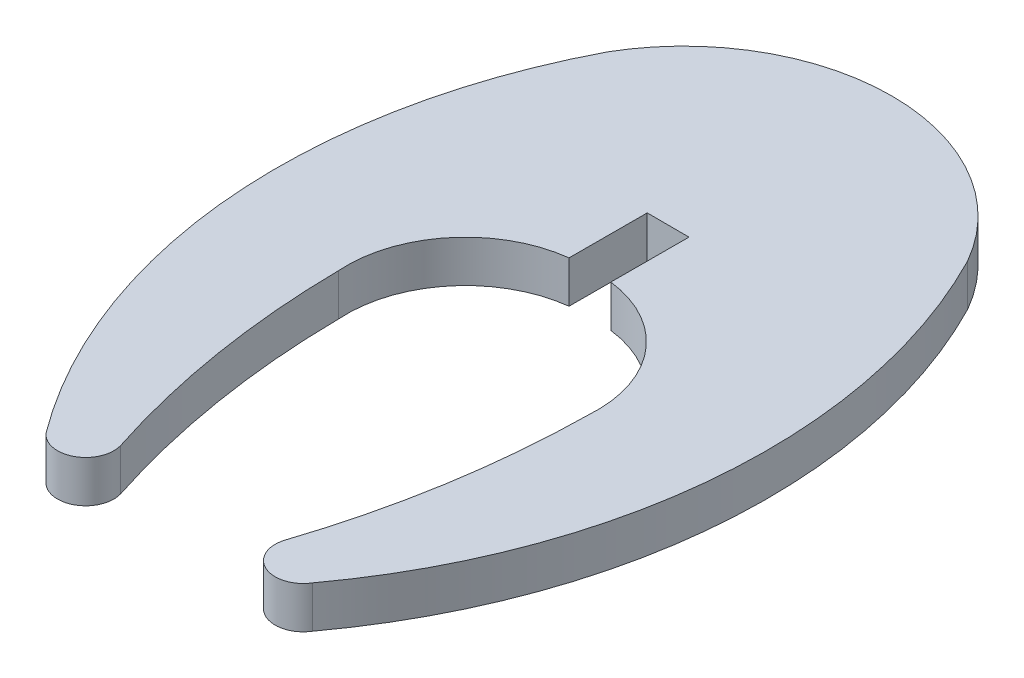
ISO-10303-21;
HEADER;
FILE_DESCRIPTION(('STEP AP214'),'2;1');
FILE_NAME('part.step','',(''),(''),'','','');
FILE_SCHEMA(('AUTOMOTIVE_DESIGN { 1 0 10303 214 1 1 1 1 }'));
ENDSEC;
DATA;
#1=APPLICATION_CONTEXT('core data for automotive mechanical design processes');
#2=APPLICATION_PROTOCOL_DEFINITION('international standard','automotive_design',2000,#1);
#3=PRODUCT_CONTEXT('',#1,'mechanical');
#4=PRODUCT('Part','Part','',(#3));
#5=PRODUCT_RELATED_PRODUCT_CATEGORY('part','',(#4));
#6=PRODUCT_DEFINITION_FORMATION('','',#4);
#7=PRODUCT_DEFINITION_CONTEXT('part definition',#1,'design');
#8=PRODUCT_DEFINITION('design','',#6,#7);
#9=PRODUCT_DEFINITION_SHAPE('','',#8);
#10=(LENGTH_UNIT() NAMED_UNIT(*) SI_UNIT(.MILLI.,.METRE.));
#11=(NAMED_UNIT(*) PLANE_ANGLE_UNIT() SI_UNIT($,.RADIAN.));
#12=(NAMED_UNIT(*) SI_UNIT($,.STERADIAN.) SOLID_ANGLE_UNIT());
#13=UNCERTAINTY_MEASURE_WITH_UNIT(LENGTH_MEASURE(1.E-05),#10,'distance_accuracy_value','');
#14=(GEOMETRIC_REPRESENTATION_CONTEXT(3) GLOBAL_UNCERTAINTY_ASSIGNED_CONTEXT((#13)) GLOBAL_UNIT_ASSIGNED_CONTEXT((#10,
#11,#12)) REPRESENTATION_CONTEXT('',''));
#15=CARTESIAN_POINT('',(0.,0.,0.));
#16=DIRECTION('',(0.,0.,1.));
#17=DIRECTION('',(1.,0.,0.));
#18=AXIS2_PLACEMENT_3D('',#15,#16,#17);
#19=CARTESIAN_POINT('',(-41978.014555,3.,-18278.107615));
#20=DIRECTION('',(0.99999818270925,0.,0.00190645697487852));
#21=DIRECTION('',(0.00190645697487852,0.,-0.99999818270925));
#22=AXIS2_PLACEMENT_3D('',#19,#20,#21);
#23=PLANE('',#22);
#24=DIRECTION('',(-0.00190645697487852,0.,0.99999818270925));
#25=VECTOR('',#24,1.);
#26=CARTESIAN_POINT('',(-41978.014555,0.,-18278.107615));
#27=LINE('',#26,#25);
#28=CARTESIAN_POINT('',(-41978.003906,0.,-18283.693359));
#29=VERTEX_POINT('',#28);
#30=CARTESIAN_POINT('',(-41978.014555,0.,-18278.107615));
#31=VERTEX_POINT('',#30);
#32=EDGE_CURVE('E155',#29,#31,#27,.T.);
#33=ORIENTED_EDGE('',*,*,#32,.T.);
#34=DIRECTION('',(0.,-1.,0.));
#35=VECTOR('',#34,1.);
#36=CARTESIAN_POINT('',(-41978.014555,3.,-18278.107615));
#37=LINE('',#36,#35);
#38=CARTESIAN_POINT('',(-41978.014555,3.,-18278.107615));
#39=VERTEX_POINT('',#38);
#40=EDGE_CURVE('E11',#39,#31,#37,.T.);
#41=ORIENTED_EDGE('',*,*,#40,.F.);
#42=DIRECTION('',(-0.00190645697487852,0.,0.99999818270925));
#43=VECTOR('',#42,1.);
#44=CARTESIAN_POINT('',(-41978.014555,3.,-18278.107615));
#45=LINE('',#44,#43);
#46=CARTESIAN_POINT('',(-41978.003906,3.,-18283.693359));
#47=VERTEX_POINT('',#46);
#48=EDGE_CURVE('E177',#47,#39,#45,.T.);
#49=ORIENTED_EDGE('',*,*,#48,.F.);
#50=DIRECTION('',(0.,-1.,0.));
#51=VECTOR('',#50,1.);
#52=CARTESIAN_POINT('',(-41978.003906,3.,-18283.693359));
#53=LINE('',#52,#51);
#54=EDGE_CURVE('E151',#47,#29,#53,.T.);
#55=ORIENTED_EDGE('',*,*,#54,.T.);
#56=EDGE_LOOP('',(#33,#41,#49,#55));
#57=FACE_BOUND('',#56,.T.);
#58=ADVANCED_FACE('F35',(#57),#23,.F.);
#59=CARTESIAN_POINT('',(-41979.0463736365,3.,-18269.6810291466));
#60=DIRECTION('',(0.,-1.,0.));
#61=DIRECTION('',(0.,0.,-1.));
#62=AXIS2_PLACEMENT_3D('',#59,#60,#61);
#63=CYLINDRICAL_SURFACE('',#62,8.48952288670097);
#64=CARTESIAN_POINT('',(-41979.0463736365,0.,-18269.6810291466));
#65=DIRECTION('',(0.,-1.,0.));
#66=DIRECTION('',(0.,0.,1.));
#67=AXIS2_PLACEMENT_3D('',#64,#65,#66);
#68=CIRCLE('',#67,8.48952288670097);
#69=CARTESIAN_POINT('',(-41970.581367,0.,-18269.036311));
#70=VERTEX_POINT('',#69);
#71=EDGE_CURVE('E158',#31,#70,#68,.T.);
#72=ORIENTED_EDGE('',*,*,#71,.T.);
#73=DIRECTION('',(0.,-1.,0.));
#74=VECTOR('',#73,1.);
#75=CARTESIAN_POINT('',(-41970.581367,3.,-18269.036311));
#76=LINE('',#75,#74);
#77=CARTESIAN_POINT('',(-41970.581367,3.,-18269.036311));
#78=VERTEX_POINT('',#77);
#79=EDGE_CURVE('E43',#78,#70,#76,.T.);
#80=ORIENTED_EDGE('',*,*,#79,.F.);
#81=CARTESIAN_POINT('',(-41979.0463736365,3.,-18269.6810291466));
#82=DIRECTION('',(0.,-1.,0.));
#83=DIRECTION('',(0.,0.,1.));
#84=AXIS2_PLACEMENT_3D('',#81,#82,#83);
#85=CIRCLE('',#84,8.48952288670097);
#86=EDGE_CURVE('E106',#39,#78,#85,.T.);
#87=ORIENTED_EDGE('',*,*,#86,.F.);
#88=ORIENTED_EDGE('',*,*,#40,.T.);
#89=EDGE_LOOP('',(#72,#80,#87,#88));
#90=FACE_BOUND('',#89,.T.);
#91=ADVANCED_FACE('F255',(#90),#63,.F.);
#92=CARTESIAN_POINT('',(-42032.8945841506,3.,-18269.8590562763));
#93=DIRECTION('',(0.,-1.,0.));
#94=DIRECTION('',(0.,0.,-1.));
#95=AXIS2_PLACEMENT_3D('',#92,#93,#94);
#96=CYLINDRICAL_SURFACE('',#95,62.3186484243966);
#97=CARTESIAN_POINT('',(-42032.8945841506,0.,-18269.8590562763));
#98=DIRECTION('',(0.,-1.,0.));
#99=DIRECTION('',(0.,0.,1.));
#100=AXIS2_PLACEMENT_3D('',#97,#98,#99);
#101=CIRCLE('',#100,62.3186484243966);
#102=CARTESIAN_POINT('',(-41973.686376,0.,-18250.416782));
#103=VERTEX_POINT('',#102);
#104=EDGE_CURVE('E160',#70,#103,#101,.T.);
#105=ORIENTED_EDGE('',*,*,#104,.T.);
#106=DIRECTION('',(0.,-1.,0.));
#107=VECTOR('',#106,1.);
#108=CARTESIAN_POINT('',(-41973.686376,3.,-18250.416782));
#109=LINE('',#108,#107);
#110=CARTESIAN_POINT('',(-41973.686376,3.,-18250.416782));
#111=VERTEX_POINT('',#110);
#112=EDGE_CURVE('E196',#111,#103,#109,.T.);
#113=ORIENTED_EDGE('',*,*,#112,.F.);
#114=CARTESIAN_POINT('',(-42032.8945841506,3.,-18269.8590562763));
#115=DIRECTION('',(0.,-1.,0.));
#116=DIRECTION('',(0.,0.,1.));
#117=AXIS2_PLACEMENT_3D('',#114,#115,#116);
#118=CIRCLE('',#117,62.3186484243966);
#119=EDGE_CURVE('E204',#78,#111,#118,.T.);
#120=ORIENTED_EDGE('',*,*,#119,.F.);
#121=ORIENTED_EDGE('',*,*,#79,.T.);
#122=EDGE_LOOP('',(#105,#113,#120,#121));
#123=FACE_BOUND('',#122,.T.);
#124=ADVANCED_FACE('F202',(#123),#96,.F.);
#125=CARTESIAN_POINT('',(-41971.7584335091,3.,-18249.832309272));
#126=DIRECTION('',(0.,-1.,0.));
#127=DIRECTION('',(0.,0.,-1.));
#128=AXIS2_PLACEMENT_3D('',#125,#126,#127);
#129=CYLINDRICAL_SURFACE('',#128,2.01458944149974);
#130=CARTESIAN_POINT('',(-41971.7584335091,0.,-18249.832309272));
#131=DIRECTION('',(0.,1.,0.));
#132=DIRECTION('',(0.,0.,1.));
#133=AXIS2_PLACEMENT_3D('',#130,#131,#132);
#134=CIRCLE('',#133,2.01458944149974);
#135=CARTESIAN_POINT('',(-41970.038411,0.,-18248.783456));
#136=VERTEX_POINT('',#135);
#137=EDGE_CURVE('E162',#103,#136,#134,.T.);
#138=ORIENTED_EDGE('',*,*,#137,.T.);
#139=DIRECTION('',(0.,-1.,0.));
#140=VECTOR('',#139,1.);
#141=CARTESIAN_POINT('',(-41970.038411,3.,-18248.783456));
#142=LINE('',#141,#140);
#143=CARTESIAN_POINT('',(-41970.038411,3.,-18248.783456));
#144=VERTEX_POINT('',#143);
#145=EDGE_CURVE('E193',#144,#136,#142,.T.);
#146=ORIENTED_EDGE('',*,*,#145,.F.);
#147=CARTESIAN_POINT('',(-41971.7584335091,3.,-18249.832309272));
#148=DIRECTION('',(0.,1.,0.));
#149=DIRECTION('',(0.,0.,1.));
#150=AXIS2_PLACEMENT_3D('',#147,#148,#149);
#151=CIRCLE('',#150,2.01458944149974);
#152=EDGE_CURVE('E222',#111,#144,#151,.T.);
#153=ORIENTED_EDGE('',*,*,#152,.F.);
#154=ORIENTED_EDGE('',*,*,#112,.T.);
#155=EDGE_LOOP('',(#138,#146,#153,#154));
#156=FACE_BOUND('',#155,.T.);
#157=ADVANCED_FACE('F213',(#156),#129,.T.);
#158=CARTESIAN_POINT('',(-42003.3360082486,3.,-18273.3038001917));
#159=DIRECTION('',(0.,-1.,0.));
#160=DIRECTION('',(0.,0.,-1.));
#161=AXIS2_PLACEMENT_3D('',#158,#159,#160);
#162=CYLINDRICAL_SURFACE('',#161,41.3518713216953);
#163=CARTESIAN_POINT('',(-42003.3360082486,0.,-18273.3038001917));
#164=DIRECTION('',(0.,1.,0.));
#165=DIRECTION('',(0.,0.,1.));
#166=AXIS2_PLACEMENT_3D('',#163,#164,#165);
#167=CIRCLE('',#166,41.3518713216953);
#168=CARTESIAN_POINT('',(-41966.550728,0.,-18292.193491));
#169=VERTEX_POINT('',#168);
#170=EDGE_CURVE('E164',#136,#169,#167,.T.);
#171=ORIENTED_EDGE('',*,*,#170,.T.);
#172=DIRECTION('',(0.,-1.,0.));
#173=VECTOR('',#172,1.);
#174=CARTESIAN_POINT('',(-41966.550728,3.,-18292.193491));
#175=LINE('',#174,#173);
#176=CARTESIAN_POINT('',(-41966.550728,3.,-18292.193491));
#177=VERTEX_POINT('',#176);
#178=EDGE_CURVE('E190',#177,#169,#175,.T.);
#179=ORIENTED_EDGE('',*,*,#178,.F.);
#180=CARTESIAN_POINT('',(-42003.3360082486,3.,-18273.3038001917));
#181=DIRECTION('',(0.,1.,0.));
#182=DIRECTION('',(0.,0.,1.));
#183=AXIS2_PLACEMENT_3D('',#180,#181,#182);
#184=CIRCLE('',#183,41.3518713216953);
#185=EDGE_CURVE('E219',#144,#177,#184,.T.);
#186=ORIENTED_EDGE('',*,*,#185,.F.);
#187=ORIENTED_EDGE('',*,*,#145,.T.);
#188=EDGE_LOOP('',(#171,#179,#186,#187));
#189=FACE_BOUND('',#188,.T.);
#190=ADVANCED_FACE('F217',(#189),#162,.T.);
#191=CARTESIAN_POINT('',(-41979.499189316,3.,-18284.8027257882));
#192=DIRECTION('',(0.,-1.,0.));
#193=DIRECTION('',(0.,0.,-1.));
#194=AXIS2_PLACEMENT_3D('',#191,#192,#193);
#195=CYLINDRICAL_SURFACE('',#194,14.9092609095013);
#196=CARTESIAN_POINT('',(-41979.499189316,0.,-18284.8027257882));
#197=DIRECTION('',(0.,1.,0.));
#198=DIRECTION('',(0.,0.,1.));
#199=AXIS2_PLACEMENT_3D('',#196,#197,#198);
#200=CIRCLE('',#199,14.9092609095013);
#201=CARTESIAN_POINT('',(-41992.4218499999,0.,-18292.238511));
#202=VERTEX_POINT('',#201);
#203=EDGE_CURVE('E166',#169,#202,#200,.T.);
#204=ORIENTED_EDGE('',*,*,#203,.T.);
#205=DIRECTION('',(0.,-1.,0.));
#206=VECTOR('',#205,1.);
#207=CARTESIAN_POINT('',(-41992.4218499999,3.,-18292.238511));
#208=LINE('',#207,#206);
#209=CARTESIAN_POINT('',(-41992.4218499999,3.,-18292.238511));
#210=VERTEX_POINT('',#209);
#211=EDGE_CURVE('E187',#210,#202,#208,.T.);
#212=ORIENTED_EDGE('',*,*,#211,.F.);
#213=CARTESIAN_POINT('',(-41979.499189316,3.,-18284.8027257882));
#214=DIRECTION('',(0.,1.,0.));
#215=DIRECTION('',(0.,0.,1.));
#216=AXIS2_PLACEMENT_3D('',#213,#214,#215);
#217=CIRCLE('',#216,14.9092609095013);
#218=EDGE_CURVE('E221',#177,#210,#217,.T.);
#219=ORIENTED_EDGE('',*,*,#218,.F.);
#220=ORIENTED_EDGE('',*,*,#178,.T.);
#221=EDGE_LOOP('',(#204,#212,#219,#220));
#222=FACE_BOUND('',#221,.T.);
#223=ADVANCED_FACE('F268',(#222),#195,.T.);
#224=CARTESIAN_POINT('',(-41955.703242732,3.,-18273.2201987383));
#225=DIRECTION('',(0.,-1.,0.));
#226=DIRECTION('',(0.,0.,-1.));
#227=AXIS2_PLACEMENT_3D('',#224,#225,#226);
#228=CYLINDRICAL_SURFACE('',#227,41.3515697523059);
#229=CARTESIAN_POINT('',(-41955.703242732,0.,-18273.2201987383));
#230=DIRECTION('',(0.,1.,0.));
#231=DIRECTION('',(0.,0.,1.));
#232=AXIS2_PLACEMENT_3D('',#229,#230,#231);
#233=CIRCLE('',#232,41.3515697523059);
#234=CARTESIAN_POINT('',(-41988.869274,0.,-18248.5226949999));
#235=VERTEX_POINT('',#234);
#236=EDGE_CURVE('E168',#202,#235,#233,.T.);
#237=ORIENTED_EDGE('',*,*,#236,.T.);
#238=DIRECTION('',(0.,-1.,0.));
#239=VECTOR('',#238,1.);
#240=CARTESIAN_POINT('',(-41988.869274,3.,-18248.5226949999));
#241=LINE('',#240,#239);
#242=CARTESIAN_POINT('',(-41988.869274,3.,-18248.5226949999));
#243=VERTEX_POINT('',#242);
#244=EDGE_CURVE('E184',#243,#235,#241,.T.);
#245=ORIENTED_EDGE('',*,*,#244,.F.);
#246=CARTESIAN_POINT('',(-41955.703242732,3.,-18273.2201987383));
#247=DIRECTION('',(0.,1.,0.));
#248=DIRECTION('',(0.,0.,1.));
#249=AXIS2_PLACEMENT_3D('',#246,#247,#248);
#250=CIRCLE('',#249,41.3515697523059);
#251=EDGE_CURVE('E224',#210,#243,#250,.T.);
#252=ORIENTED_EDGE('',*,*,#251,.F.);
#253=ORIENTED_EDGE('',*,*,#211,.T.);
#254=EDGE_LOOP('',(#237,#245,#252,#253));
#255=FACE_BOUND('',#254,.T.);
#256=ADVANCED_FACE('F271',(#255),#228,.T.);
#257=CARTESIAN_POINT('',(-41987.3605882213,3.,-18249.8567467603));
#258=DIRECTION('',(0.,-1.,0.));
#259=DIRECTION('',(0.,0.,-1.));
#260=AXIS2_PLACEMENT_3D('',#257,#258,#259);
#261=CYLINDRICAL_SURFACE('',#260,2.01390835897314);
#262=CARTESIAN_POINT('',(-41987.3605882213,0.,-18249.8567467603));
#263=DIRECTION('',(0.,1.,0.));
#264=DIRECTION('',(0.,0.,1.));
#265=AXIS2_PLACEMENT_3D('',#262,#263,#264);
#266=CIRCLE('',#265,2.01390835897314);
#267=CARTESIAN_POINT('',(-41985.431754,0.,-18250.435906));
#268=VERTEX_POINT('',#267);
#269=EDGE_CURVE('E170',#235,#268,#266,.T.);
#270=ORIENTED_EDGE('',*,*,#269,.T.);
#271=DIRECTION('',(0.,-1.,0.));
#272=VECTOR('',#271,1.);
#273=CARTESIAN_POINT('',(-41985.431754,3.,-18250.435906));
#274=LINE('',#273,#272);
#275=CARTESIAN_POINT('',(-41985.431754,3.,-18250.435906));
#276=VERTEX_POINT('',#275);
#277=EDGE_CURVE('E181',#276,#268,#274,.T.);
#278=ORIENTED_EDGE('',*,*,#277,.F.);
#279=CARTESIAN_POINT('',(-41987.3605882213,3.,-18249.8567467603));
#280=DIRECTION('',(0.,1.,0.));
#281=DIRECTION('',(0.,0.,1.));
#282=AXIS2_PLACEMENT_3D('',#279,#280,#281);
#283=CIRCLE('',#282,2.01390835897314);
#284=EDGE_CURVE('E230',#243,#276,#283,.T.);
#285=ORIENTED_EDGE('',*,*,#284,.F.);
#286=ORIENTED_EDGE('',*,*,#244,.T.);
#287=EDGE_LOOP('',(#270,#278,#285,#286));
#288=FACE_BOUND('',#287,.T.);
#289=ADVANCED_FACE('F236',(#288),#261,.T.);
#290=CARTESIAN_POINT('',(-41926.1555870674,3.,-18269.6678099927));
#291=DIRECTION('',(0.,-1.,0.));
#292=DIRECTION('',(0.,0.,-1.));
#293=AXIS2_PLACEMENT_3D('',#290,#291,#292);
#294=CYLINDRICAL_SURFACE('',#293,62.3179757164994);
#295=CARTESIAN_POINT('',(-41926.1555870674,0.,-18269.6678099927));
#296=DIRECTION('',(0.,-1.,0.));
#297=DIRECTION('',(0.,0.,1.));
#298=AXIS2_PLACEMENT_3D('',#295,#296,#297);
#299=CIRCLE('',#298,62.3179757164994);
#300=CARTESIAN_POINT('',(-41988.470698,0.,-18269.070276));
#301=VERTEX_POINT('',#300);
#302=EDGE_CURVE('E172',#268,#301,#299,.T.);
#303=ORIENTED_EDGE('',*,*,#302,.T.);
#304=DIRECTION('',(0.,-1.,0.));
#305=VECTOR('',#304,1.);
#306=CARTESIAN_POINT('',(-41988.470698,3.,-18269.070276));
#307=LINE('',#306,#305);
#308=CARTESIAN_POINT('',(-41988.470698,3.,-18269.070276));
#309=VERTEX_POINT('',#308);
#310=EDGE_CURVE('E146',#309,#301,#307,.T.);
#311=ORIENTED_EDGE('',*,*,#310,.F.);
#312=CARTESIAN_POINT('',(-41926.1555870674,3.,-18269.6678099927));
#313=DIRECTION('',(0.,-1.,0.));
#314=DIRECTION('',(0.,0.,1.));
#315=AXIS2_PLACEMENT_3D('',#312,#313,#314);
#316=CIRCLE('',#315,62.3179757164994);
#317=EDGE_CURVE('E137',#276,#309,#316,.T.);
#318=ORIENTED_EDGE('',*,*,#317,.F.);
#319=ORIENTED_EDGE('',*,*,#277,.T.);
#320=EDGE_LOOP('',(#303,#311,#318,#319));
#321=FACE_BOUND('',#320,.T.);
#322=ADVANCED_FACE('F240',(#321),#294,.F.);
#323=CARTESIAN_POINT('',(-41980.0044581417,3.,-18269.6829247474));
#324=DIRECTION('',(0.,-1.,0.));
#325=DIRECTION('',(0.,0.,-1.));
#326=AXIS2_PLACEMENT_3D('',#323,#324,#325);
#327=CYLINDRICAL_SURFACE('',#326,8.4883776909998);
#328=CARTESIAN_POINT('',(-41980.0044581417,0.,-18269.6829247474));
#329=DIRECTION('',(0.,-1.,0.));
#330=DIRECTION('',(0.,0.,1.));
#331=AXIS2_PLACEMENT_3D('',#328,#329,#330);
#332=CIRCLE('',#331,8.4883776909998);
#333=CARTESIAN_POINT('',(-41981.011719,0.,-18278.111328));
#334=VERTEX_POINT('',#333);
#335=EDGE_CURVE('E145',#301,#334,#332,.T.);
#336=ORIENTED_EDGE('',*,*,#335,.T.);
#337=DIRECTION('',(0.,-1.,0.));
#338=VECTOR('',#337,1.);
#339=CARTESIAN_POINT('',(-41981.011719,3.,-18278.111328));
#340=LINE('',#339,#338);
#341=CARTESIAN_POINT('',(-41981.011719,3.,-18278.111328));
#342=VERTEX_POINT('',#341);
#343=EDGE_CURVE('E142',#342,#334,#340,.T.);
#344=ORIENTED_EDGE('',*,*,#343,.F.);
#345=CARTESIAN_POINT('',(-41980.0044581417,3.,-18269.6829247474));
#346=DIRECTION('',(0.,-1.,0.));
#347=DIRECTION('',(0.,0.,1.));
#348=AXIS2_PLACEMENT_3D('',#345,#346,#347);
#349=CIRCLE('',#348,8.4883776909998);
#350=EDGE_CURVE('E131',#309,#342,#349,.T.);
#351=ORIENTED_EDGE('',*,*,#350,.F.);
#352=ORIENTED_EDGE('',*,*,#310,.T.);
#353=EDGE_LOOP('',(#336,#344,#351,#352));
#354=FACE_BOUND('',#353,.T.);
#355=ADVANCED_FACE('F143',(#354),#327,.F.);
#356=CARTESIAN_POINT('',(-41981.,3.,-18283.701172));
#357=DIRECTION('',(-0.999997802391605,0.,-0.00209647608161602));
#358=DIRECTION('',(-0.00209647608161602,0.,0.999997802391605));
#359=AXIS2_PLACEMENT_3D('',#356,#357,#358);
#360=PLANE('',#359);
#361=DIRECTION('',(0.00209647608161602,0.,-0.999997802391605));
#362=VECTOR('',#361,1.);
#363=CARTESIAN_POINT('',(-41981.,0.,-18283.701172));
#364=LINE('',#363,#362);
#365=CARTESIAN_POINT('',(-41981.,0.,-18283.701172));
#366=VERTEX_POINT('',#365);
#367=EDGE_CURVE('E92',#334,#366,#364,.T.);
#368=ORIENTED_EDGE('',*,*,#367,.T.);
#369=DIRECTION('',(0.,-1.,0.));
#370=VECTOR('',#369,1.);
#371=CARTESIAN_POINT('',(-41981.,3.,-18283.701172));
#372=LINE('',#371,#370);
#373=CARTESIAN_POINT('',(-41981.,3.,-18283.701172));
#374=VERTEX_POINT('',#373);
#375=EDGE_CURVE('E147',#374,#366,#372,.T.);
#376=ORIENTED_EDGE('',*,*,#375,.F.);
#377=DIRECTION('',(0.00209647608161602,0.,-0.999997802391605));
#378=VECTOR('',#377,1.);
#379=CARTESIAN_POINT('',(-41981.,3.,-18283.701172));
#380=LINE('',#379,#378);
#381=EDGE_CURVE('E135',#342,#374,#380,.T.);
#382=ORIENTED_EDGE('',*,*,#381,.F.);
#383=ORIENTED_EDGE('',*,*,#343,.T.);
#384=EDGE_LOOP('',(#368,#376,#382,#383));
#385=FACE_BOUND('',#384,.T.);
#386=ADVANCED_FACE('F149',(#385),#360,.F.);
#387=CARTESIAN_POINT('',(-41978.003906,3.,-18283.693359));
#388=DIRECTION('',(0.00260771972935821,0.,-0.999996599893126));
#389=DIRECTION('',(-0.999996599893126,0.,-0.00260771972935821));
#390=AXIS2_PLACEMENT_3D('',#387,#388,#389);
#391=PLANE('',#390);
#392=DIRECTION('',(0.999996599893126,0.,0.00260771972935821));
#393=VECTOR('',#392,1.);
#394=CARTESIAN_POINT('',(-41978.003906,0.,-18283.693359));
#395=LINE('',#394,#393);
#396=EDGE_CURVE('E98',#366,#29,#395,.T.);
#397=ORIENTED_EDGE('',*,*,#396,.T.);
#398=ORIENTED_EDGE('',*,*,#54,.F.);
#399=DIRECTION('',(0.999996599893126,0.,0.00260771972935821));
#400=VECTOR('',#399,1.);
#401=CARTESIAN_POINT('',(-41978.003906,3.,-18283.693359));
#402=LINE('',#401,#400);
#403=EDGE_CURVE('E51',#374,#47,#402,.T.);
#404=ORIENTED_EDGE('',*,*,#403,.F.);
#405=ORIENTED_EDGE('',*,*,#375,.T.);
#406=EDGE_LOOP('',(#397,#398,#404,#405));
#407=FACE_BOUND('',#406,.T.);
#408=ADVANCED_FACE('F244',(#407),#391,.F.);
#409=CARTESIAN_POINT('',(-41980.0044581417,3.,-18269.6829247474));
#410=DIRECTION('',(0.,1.,0.));
#411=DIRECTION('',(0.,0.,1.));
#412=AXIS2_PLACEMENT_3D('',#409,#410,#411);
#413=PLANE('',#412);
#414=ORIENTED_EDGE('',*,*,#48,.T.);
#415=ORIENTED_EDGE('',*,*,#86,.T.);
#416=ORIENTED_EDGE('',*,*,#119,.T.);
#417=ORIENTED_EDGE('',*,*,#152,.T.);
#418=ORIENTED_EDGE('',*,*,#185,.T.);
#419=ORIENTED_EDGE('',*,*,#218,.T.);
#420=ORIENTED_EDGE('',*,*,#251,.T.);
#421=ORIENTED_EDGE('',*,*,#284,.T.);
#422=ORIENTED_EDGE('',*,*,#317,.T.);
#423=ORIENTED_EDGE('',*,*,#350,.T.);
#424=ORIENTED_EDGE('',*,*,#381,.T.);
#425=ORIENTED_EDGE('',*,*,#403,.T.);
#426=EDGE_LOOP('',(#414,#415,#416,#417,#418,#419,#420,#421,#422,#423,#424,#425));
#427=FACE_BOUND('',#426,.T.);
#428=ADVANCED_FACE('F133',(#427),#413,.T.);
#429=CARTESIAN_POINT('',(-41980.0044581417,0.,-18269.6829247474));
#430=DIRECTION('',(0.,1.,0.));
#431=DIRECTION('',(0.,0.,1.));
#432=AXIS2_PLACEMENT_3D('',#429,#430,#431);
#433=PLANE('',#432);
#434=ORIENTED_EDGE('',*,*,#32,.F.);
#435=ORIENTED_EDGE('',*,*,#396,.F.);
#436=ORIENTED_EDGE('',*,*,#367,.F.);
#437=ORIENTED_EDGE('',*,*,#335,.F.);
#438=ORIENTED_EDGE('',*,*,#302,.F.);
#439=ORIENTED_EDGE('',*,*,#269,.F.);
#440=ORIENTED_EDGE('',*,*,#236,.F.);
#441=ORIENTED_EDGE('',*,*,#203,.F.);
#442=ORIENTED_EDGE('',*,*,#170,.F.);
#443=ORIENTED_EDGE('',*,*,#137,.F.);
#444=ORIENTED_EDGE('',*,*,#104,.F.);
#445=ORIENTED_EDGE('',*,*,#71,.F.);
#446=EDGE_LOOP('',(#434,#435,#436,#437,#438,#439,#440,#441,#442,#443,#444,#445));
#447=FACE_BOUND('',#446,.T.);
#448=ADVANCED_FACE('F208',(#447),#433,.F.);
#449=CLOSED_SHELL('',(#58,#91,#124,#157,#190,#223,#256,#289,#322,#355,#386,#408,#428,#448));
#450=MANIFOLD_SOLID_BREP('B2',#449);
#451=ADVANCED_BREP_SHAPE_REPRESENTATION('',(#18,#450),#14);
#452=SHAPE_DEFINITION_REPRESENTATION(#9,#451);
ENDSEC;
END-ISO-10303-21;
